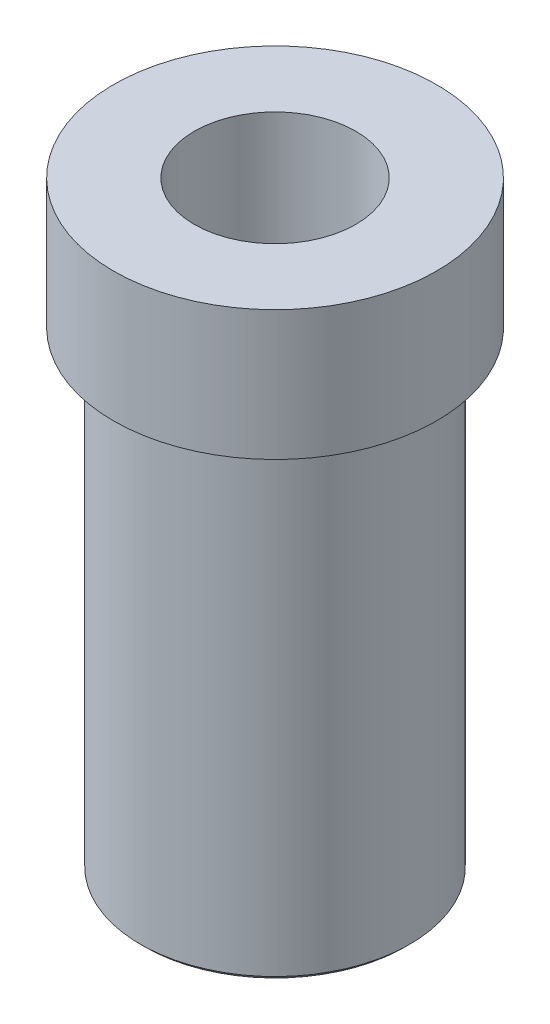
ISO-10303-21;
HEADER;
FILE_DESCRIPTION(('STEP AP214'),'2;1');
FILE_NAME('part.step','',(''),(''),'','','');
FILE_SCHEMA(('AUTOMOTIVE_DESIGN { 1 0 10303 214 1 1 1 1 }'));
ENDSEC;
DATA;
#1=APPLICATION_CONTEXT('core data for automotive mechanical design processes');
#2=APPLICATION_PROTOCOL_DEFINITION('international standard','automotive_design',2000,#1);
#3=PRODUCT_CONTEXT('',#1,'mechanical');
#4=PRODUCT('Part','Part','',(#3));
#5=PRODUCT_RELATED_PRODUCT_CATEGORY('part','',(#4));
#6=PRODUCT_DEFINITION_FORMATION('','',#4);
#7=PRODUCT_DEFINITION_CONTEXT('part definition',#1,'design');
#8=PRODUCT_DEFINITION('design','',#6,#7);
#9=PRODUCT_DEFINITION_SHAPE('','',#8);
#10=(LENGTH_UNIT() NAMED_UNIT(*) SI_UNIT(.MILLI.,.METRE.));
#11=(NAMED_UNIT(*) PLANE_ANGLE_UNIT() SI_UNIT($,.RADIAN.));
#12=(NAMED_UNIT(*) SI_UNIT($,.STERADIAN.) SOLID_ANGLE_UNIT());
#13=UNCERTAINTY_MEASURE_WITH_UNIT(LENGTH_MEASURE(1.E-05),#10,'distance_accuracy_value','');
#14=(GEOMETRIC_REPRESENTATION_CONTEXT(3) GLOBAL_UNCERTAINTY_ASSIGNED_CONTEXT((#13)) GLOBAL_UNIT_ASSIGNED_CONTEXT((#10,
#11,#12)) REPRESENTATION_CONTEXT('',''));
#15=CARTESIAN_POINT('',(0.,0.,0.));
#16=DIRECTION('',(0.,0.,1.));
#17=DIRECTION('',(1.,0.,0.));
#18=AXIS2_PLACEMENT_3D('',#15,#16,#17);
#19=CARTESIAN_POINT('',(0.,-0.253999999999998,0.));
#20=DIRECTION('',(0.,1.,0.));
#21=DIRECTION('',(0.,0.,1.));
#22=AXIS2_PLACEMENT_3D('',#19,#20,#21);
#23=CYLINDRICAL_SURFACE('',#22,4.7625);
#24=CARTESIAN_POINT('',(0.,-0.253999999999998,0.));
#25=DIRECTION('',(0.,1.,0.));
#26=DIRECTION('',(0.,0.,1.));
#27=AXIS2_PLACEMENT_3D('',#24,#25,#26);
#28=CIRCLE('',#27,4.7625);
#29=CARTESIAN_POINT('',(0.,-0.253999999999998,4.7625));
#30=VERTEX_POINT('',#29);
#31=EDGE_CURVE('E53',#30,#30,#28,.T.);
#32=ORIENTED_EDGE('',*,*,#31,.T.);
#33=EDGE_LOOP('',(#32));
#34=FACE_BOUND('',#33,.T.);
#35=CARTESIAN_POINT('',(0.,3.571875,0.));
#36=DIRECTION('',(0.,1.,0.));
#37=DIRECTION('',(0.,0.,1.));
#38=AXIS2_PLACEMENT_3D('',#35,#36,#37);
#39=CIRCLE('',#38,4.7625);
#40=CARTESIAN_POINT('',(0.,3.571875,4.7625));
#41=VERTEX_POINT('',#40);
#42=EDGE_CURVE('E58',#41,#41,#39,.T.);
#43=ORIENTED_EDGE('',*,*,#42,.F.);
#44=EDGE_LOOP('',(#43));
#45=FACE_BOUND('',#44,.T.);
#46=ADVANCED_FACE('F37',(#34,#45),#23,.T.);
#47=CARTESIAN_POINT('',(0.,-0.253999999999998,0.));
#48=DIRECTION('',(0.,1.,0.));
#49=DIRECTION('',(0.,0.,1.));
#50=AXIS2_PLACEMENT_3D('',#47,#48,#49);
#51=PLANE('',#50);
#52=CARTESIAN_POINT('',(0.,-0.253999999999998,0.));
#53=DIRECTION('',(0.,-1.,0.));
#54=DIRECTION('',(0.,0.,-1.));
#55=AXIS2_PLACEMENT_3D('',#52,#53,#54);
#56=CIRCLE('',#55,3.96875);
#57=CARTESIAN_POINT('',(0.,-0.253999999999998,-3.96875));
#58=VERTEX_POINT('',#57);
#59=EDGE_CURVE('E49',#58,#58,#56,.T.);
#60=ORIENTED_EDGE('',*,*,#59,.F.);
#61=EDGE_LOOP('',(#60));
#62=FACE_BOUND('',#61,.T.);
#63=ORIENTED_EDGE('',*,*,#31,.F.);
#64=EDGE_LOOP('',(#63));
#65=FACE_BOUND('',#64,.T.);
#66=ADVANCED_FACE('F86',(#62,#65),#51,.F.);
#67=CARTESIAN_POINT('',(0.,3.571875,0.));
#68=DIRECTION('',(0.,1.,0.));
#69=DIRECTION('',(0.,0.,1.));
#70=AXIS2_PLACEMENT_3D('',#67,#68,#69);
#71=PLANE('',#70);
#72=CARTESIAN_POINT('',(0.,3.571875,0.));
#73=DIRECTION('',(0.,-1.,0.));
#74=DIRECTION('',(0.,0.,-1.));
#75=AXIS2_PLACEMENT_3D('',#72,#73,#74);
#76=CIRCLE('',#75,2.38125);
#77=CARTESIAN_POINT('',(0.,3.571875,-2.38125));
#78=VERTEX_POINT('',#77);
#79=EDGE_CURVE('E60',#78,#78,#76,.T.);
#80=ORIENTED_EDGE('',*,*,#79,.T.);
#81=EDGE_LOOP('',(#80));
#82=FACE_BOUND('',#81,.T.);
#83=ORIENTED_EDGE('',*,*,#42,.T.);
#84=EDGE_LOOP('',(#83));
#85=FACE_BOUND('',#84,.T.);
#86=ADVANCED_FACE('F68',(#82,#85),#71,.T.);
#87=CARTESIAN_POINT('',(0.,-14.144625,0.));
#88=DIRECTION('',(0.,1.,0.));
#89=DIRECTION('',(0.,0.,1.));
#90=AXIS2_PLACEMENT_3D('',#87,#88,#89);
#91=CYLINDRICAL_SURFACE('',#90,3.96875);
#92=CARTESIAN_POINT('',(0.,-14.017625,0.));
#93=DIRECTION('',(0.,-1.,0.));
#94=DIRECTION('',(0.,0.,-1.));
#95=AXIS2_PLACEMENT_3D('',#92,#93,#94);
#96=CIRCLE('',#95,3.96875);
#97=CARTESIAN_POINT('',(0.,-14.017625,-3.96875));
#98=VERTEX_POINT('',#97);
#99=EDGE_CURVE('E10',#98,#98,#96,.F.);
#100=ORIENTED_EDGE('',*,*,#99,.T.);
#101=EDGE_LOOP('',(#100));
#102=FACE_BOUND('',#101,.T.);
#103=ORIENTED_EDGE('',*,*,#59,.T.);
#104=EDGE_LOOP('',(#103));
#105=FACE_BOUND('',#104,.T.);
#106=ADVANCED_FACE('F79',(#102,#105),#91,.T.);
#107=CARTESIAN_POINT('',(0.,-14.144625,0.));
#108=DIRECTION('',(0.,-1.,0.));
#109=DIRECTION('',(0.,0.,-1.));
#110=AXIS2_PLACEMENT_3D('',#107,#108,#109);
#111=PLANE('',#110);
#112=CARTESIAN_POINT('',(0.,-14.144625,0.));
#113=DIRECTION('',(0.,-1.,0.));
#114=DIRECTION('',(0.,0.,-1.));
#115=AXIS2_PLACEMENT_3D('',#112,#113,#114);
#116=CIRCLE('',#115,3.84174999999999);
#117=CARTESIAN_POINT('',(0.,-14.144625,-3.84174999999999));
#118=VERTEX_POINT('',#117);
#119=EDGE_CURVE('E45',#118,#118,#116,.T.);
#120=ORIENTED_EDGE('',*,*,#119,.T.);
#121=EDGE_LOOP('',(#120));
#122=FACE_BOUND('',#121,.T.);
#123=CARTESIAN_POINT('',(0.,-14.144625,0.));
#124=DIRECTION('',(0.,-1.,0.));
#125=DIRECTION('',(0.,0.,-1.));
#126=AXIS2_PLACEMENT_3D('',#123,#124,#125);
#127=CIRCLE('',#126,2.38125);
#128=CARTESIAN_POINT('',(0.,-14.144625,-2.38125));
#129=VERTEX_POINT('',#128);
#130=EDGE_CURVE('E62',#129,#129,#127,.T.);
#131=ORIENTED_EDGE('',*,*,#130,.F.);
#132=EDGE_LOOP('',(#131));
#133=FACE_BOUND('',#132,.T.);
#134=ADVANCED_FACE('F74',(#122,#133),#111,.T.);
#135=CARTESIAN_POINT('',(0.,3.571875,0.));
#136=DIRECTION('',(0.,-1.,0.));
#137=DIRECTION('',(0.,0.,-1.));
#138=AXIS2_PLACEMENT_3D('',#135,#136,#137);
#139=CYLINDRICAL_SURFACE('',#138,2.38125);
#140=ORIENTED_EDGE('',*,*,#79,.F.);
#141=EDGE_LOOP('',(#140));
#142=FACE_BOUND('',#141,.T.);
#143=ORIENTED_EDGE('',*,*,#130,.T.);
#144=EDGE_LOOP('',(#143));
#145=FACE_BOUND('',#144,.T.);
#146=ADVANCED_FACE('F71',(#142,#145),#139,.F.);
#147=CARTESIAN_POINT('',(0.,-14.144625,0.));
#148=DIRECTION('',(0.,1.,0.));
#149=DIRECTION('',(0.,0.,1.));
#150=AXIS2_PLACEMENT_3D('',#147,#148,#149);
#151=CONICAL_SURFACE('',#150,3.84174999999999,0.785398163397448);
#152=ORIENTED_EDGE('',*,*,#99,.F.);
#153=EDGE_LOOP('',(#152));
#154=FACE_BOUND('',#153,.T.);
#155=ORIENTED_EDGE('',*,*,#119,.F.);
#156=EDGE_LOOP('',(#155));
#157=FACE_BOUND('',#156,.T.);
#158=ADVANCED_FACE('F40',(#154,#157),#151,.T.);
#159=CLOSED_SHELL('',(#46,#66,#86,#106,#134,#146,#158));
#160=MANIFOLD_SOLID_BREP('B2',#159);
#161=ADVANCED_BREP_SHAPE_REPRESENTATION('',(#18,#160),#14);
#162=SHAPE_DEFINITION_REPRESENTATION(#9,#161);
ENDSEC;
END-ISO-10303-21;
